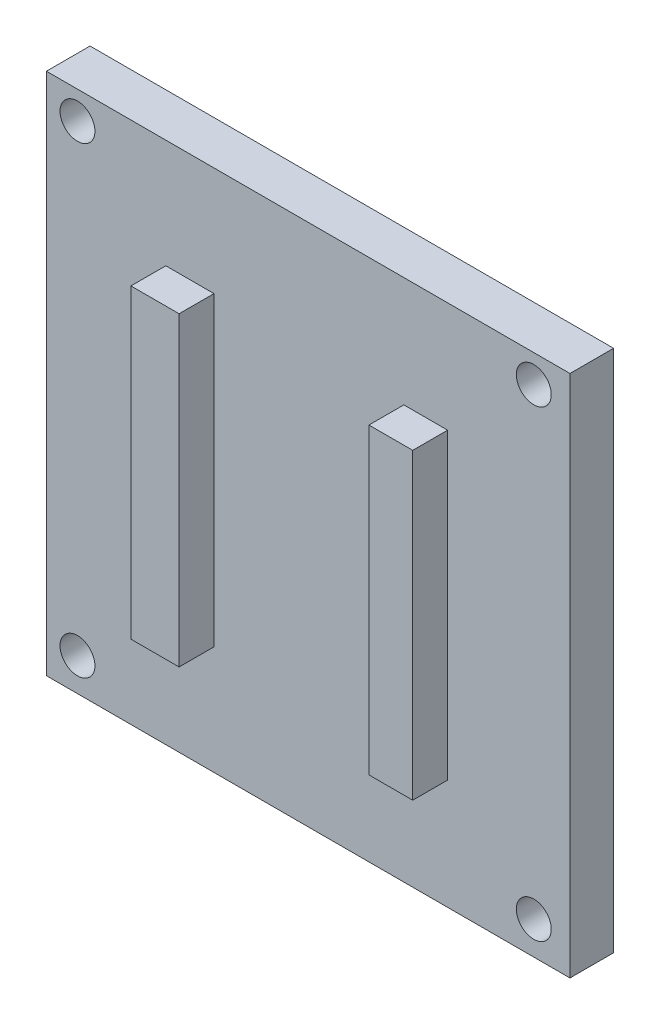
ISO-10303-21;
HEADER;
FILE_DESCRIPTION(('STEP AP214'),'2;1');
FILE_NAME('part.step','',(''),(''),'','','');
FILE_SCHEMA(('AUTOMOTIVE_DESIGN { 1 0 10303 214 1 1 1 1 }'));
ENDSEC;
DATA;
#1=APPLICATION_CONTEXT('core data for automotive mechanical design processes');
#2=APPLICATION_PROTOCOL_DEFINITION('international standard','automotive_design',2000,#1);
#3=PRODUCT_CONTEXT('',#1,'mechanical');
#4=PRODUCT('Part','Part','',(#3));
#5=PRODUCT_RELATED_PRODUCT_CATEGORY('part','',(#4));
#6=PRODUCT_DEFINITION_FORMATION('','',#4);
#7=PRODUCT_DEFINITION_CONTEXT('part definition',#1,'design');
#8=PRODUCT_DEFINITION('design','',#6,#7);
#9=PRODUCT_DEFINITION_SHAPE('','',#8);
#10=(LENGTH_UNIT() NAMED_UNIT(*) SI_UNIT(.MILLI.,.METRE.));
#11=(NAMED_UNIT(*) PLANE_ANGLE_UNIT() SI_UNIT($,.RADIAN.));
#12=(NAMED_UNIT(*) SI_UNIT($,.STERADIAN.) SOLID_ANGLE_UNIT());
#13=UNCERTAINTY_MEASURE_WITH_UNIT(LENGTH_MEASURE(1.E-05),#10,'distance_accuracy_value','');
#14=(GEOMETRIC_REPRESENTATION_CONTEXT(3) GLOBAL_UNCERTAINTY_ASSIGNED_CONTEXT((#13)) GLOBAL_UNIT_ASSIGNED_CONTEXT((#10,
#11,#12)) REPRESENTATION_CONTEXT('',''));
#15=CARTESIAN_POINT('',(0.,0.,0.));
#16=DIRECTION('',(0.,0.,1.));
#17=DIRECTION('',(1.,0.,0.));
#18=AXIS2_PLACEMENT_3D('',#15,#16,#17);
#19=CARTESIAN_POINT('',(0.,0.,0.));
#20=DIRECTION('',(0.,0.,-1.));
#21=DIRECTION('',(-1.,0.,0.));
#22=AXIS2_PLACEMENT_3D('',#19,#20,#21);
#23=PLANE('',#22);
#24=DIRECTION('',(0.,1.,0.));
#25=VECTOR('',#24,1.);
#26=CARTESIAN_POINT('',(-10.7939558553877,17.5297190054551,0.));
#27=LINE('',#26,#25);
#28=CARTESIAN_POINT('',(-10.7939558553877,-17.5297190054551,0.));
#29=VERTEX_POINT('',#28);
#30=CARTESIAN_POINT('',(-10.7939558553877,17.5297190054551,0.));
#31=VERTEX_POINT('',#30);
#32=EDGE_CURVE('E158',#29,#31,#27,.T.);
#33=ORIENTED_EDGE('',*,*,#32,.F.);
#34=DIRECTION('',(1.,0.,0.));
#35=VECTOR('',#34,1.);
#36=CARTESIAN_POINT('',(-16.316444897679,-17.5297190054551,0.));
#37=LINE('',#36,#35);
#38=CARTESIAN_POINT('',(-16.316444897679,-17.5297190054551,0.));
#39=VERTEX_POINT('',#38);
#40=EDGE_CURVE('E174',#39,#29,#37,.T.);
#41=ORIENTED_EDGE('',*,*,#40,.F.);
#42=DIRECTION('',(0.,-1.,0.));
#43=VECTOR('',#42,1.);
#44=CARTESIAN_POINT('',(-16.316444897679,17.5297190054551,0.));
#45=LINE('',#44,#43);
#46=CARTESIAN_POINT('',(-16.316444897679,17.5297190054551,0.));
#47=VERTEX_POINT('',#46);
#48=EDGE_CURVE('E187',#47,#39,#45,.T.);
#49=ORIENTED_EDGE('',*,*,#48,.F.);
#50=DIRECTION('',(-1.,0.,0.));
#51=VECTOR('',#50,1.);
#52=CARTESIAN_POINT('',(-16.316444897679,17.5297190054551,0.));
#53=LINE('',#52,#51);
#54=EDGE_CURVE('E163',#31,#47,#53,.T.);
#55=ORIENTED_EDGE('',*,*,#54,.F.);
#56=EDGE_LOOP('',(#33,#41,#49,#55));
#57=FACE_BOUND('',#56,.T.);
#58=CARTESIAN_POINT('',(25.8552896070914,-26.231822950884,0.));
#59=DIRECTION('',(0.,0.,1.));
#60=DIRECTION('',(1.,0.,0.));
#61=AXIS2_PLACEMENT_3D('',#58,#59,#60);
#62=CIRCLE('',#61,2.);
#63=CARTESIAN_POINT('',(27.8552896070914,-26.231822950884,0.));
#64=VERTEX_POINT('',#63);
#65=EDGE_CURVE('E209',#64,#64,#62,.T.);
#66=ORIENTED_EDGE('',*,*,#65,.F.);
#67=EDGE_LOOP('',(#66));
#68=FACE_BOUND('',#67,.T.);
#69=CARTESIAN_POINT('',(25.8552896070914,26.8175414856725,0.));
#70=DIRECTION('',(0.,0.,1.));
#71=DIRECTION('',(1.,0.,0.));
#72=AXIS2_PLACEMENT_3D('',#69,#70,#71);
#73=CIRCLE('',#72,2.);
#74=CARTESIAN_POINT('',(27.8552896070914,26.8175414856725,0.));
#75=VERTEX_POINT('',#74);
#76=EDGE_CURVE('E214',#75,#75,#73,.T.);
#77=ORIENTED_EDGE('',*,*,#76,.F.);
#78=EDGE_LOOP('',(#77));
#79=FACE_BOUND('',#78,.T.);
#80=CARTESIAN_POINT('',(-26.4410081418799,-26.231822950884,0.));
#81=DIRECTION('',(0.,0.,1.));
#82=DIRECTION('',(1.,0.,0.));
#83=AXIS2_PLACEMENT_3D('',#80,#81,#82);
#84=CIRCLE('',#83,2.);
#85=CARTESIAN_POINT('',(-24.4410081418799,-26.231822950884,0.));
#86=VERTEX_POINT('',#85);
#87=EDGE_CURVE('E222',#86,#86,#84,.T.);
#88=ORIENTED_EDGE('',*,*,#87,.F.);
#89=EDGE_LOOP('',(#88));
#90=FACE_BOUND('',#89,.T.);
#91=CARTESIAN_POINT('',(-26.4410081418799,26.8175414856725,0.));
#92=DIRECTION('',(0.,0.,1.));
#93=DIRECTION('',(1.,0.,0.));
#94=AXIS2_PLACEMENT_3D('',#91,#92,#93);
#95=CIRCLE('',#94,2.);
#96=CARTESIAN_POINT('',(-24.4410081418799,26.8175414856725,0.));
#97=VERTEX_POINT('',#96);
#98=EDGE_CURVE('E230',#97,#97,#95,.T.);
#99=ORIENTED_EDGE('',*,*,#98,.F.);
#100=EDGE_LOOP('',(#99));
#101=FACE_BOUND('',#100,.T.);
#102=DIRECTION('',(0.,1.,0.));
#103=VECTOR('',#102,1.);
#104=CARTESIAN_POINT('',(30.,-30.,0.));
#105=LINE('',#104,#103);
#106=CARTESIAN_POINT('',(30.,-30.,0.));
#107=VERTEX_POINT('',#106);
#108=CARTESIAN_POINT('',(30.,30.,0.));
#109=VERTEX_POINT('',#108);
#110=EDGE_CURVE('E238',#107,#109,#105,.T.);
#111=ORIENTED_EDGE('',*,*,#110,.T.);
#112=DIRECTION('',(-1.,0.,0.));
#113=VECTOR('',#112,1.);
#114=CARTESIAN_POINT('',(-30.,30.,0.));
#115=LINE('',#114,#113);
#116=CARTESIAN_POINT('',(-30.,30.,0.));
#117=VERTEX_POINT('',#116);
#118=EDGE_CURVE('E262',#109,#117,#115,.T.);
#119=ORIENTED_EDGE('',*,*,#118,.T.);
#120=DIRECTION('',(0.,-1.,0.));
#121=VECTOR('',#120,1.);
#122=CARTESIAN_POINT('',(-30.,-30.,0.));
#123=LINE('',#122,#121);
#124=CARTESIAN_POINT('',(-30.,-30.,0.));
#125=VERTEX_POINT('',#124);
#126=EDGE_CURVE('E266',#117,#125,#123,.T.);
#127=ORIENTED_EDGE('',*,*,#126,.T.);
#128=DIRECTION('',(1.,0.,0.));
#129=VECTOR('',#128,1.);
#130=CARTESIAN_POINT('',(-30.,-30.,0.));
#131=LINE('',#130,#129);
#132=EDGE_CURVE('E247',#125,#107,#131,.T.);
#133=ORIENTED_EDGE('',*,*,#132,.T.);
#134=EDGE_LOOP('',(#111,#119,#127,#133));
#135=FACE_BOUND('',#134,.T.);
#136=DIRECTION('',(0.,1.,0.));
#137=VECTOR('',#136,1.);
#138=CARTESIAN_POINT('',(15.9817485920856,17.3623708526584,0.));
#139=LINE('',#138,#137);
#140=CARTESIAN_POINT('',(15.9817485920856,-17.3623708526584,0.));
#141=VERTEX_POINT('',#140);
#142=CARTESIAN_POINT('',(15.9817485920856,17.3623708526584,0.));
#143=VERTEX_POINT('',#142);
#144=EDGE_CURVE('E156',#141,#143,#139,.T.);
#145=ORIENTED_EDGE('',*,*,#144,.F.);
#146=DIRECTION('',(1.,0.,0.));
#147=VECTOR('',#146,1.);
#148=CARTESIAN_POINT('',(10.9613040081844,-17.3623708526584,0.));
#149=LINE('',#148,#147);
#150=CARTESIAN_POINT('',(10.9613040081844,-17.3623708526584,0.));
#151=VERTEX_POINT('',#150);
#152=EDGE_CURVE('E153',#151,#141,#149,.T.);
#153=ORIENTED_EDGE('',*,*,#152,.F.);
#154=DIRECTION('',(0.,-1.,0.));
#155=VECTOR('',#154,1.);
#156=CARTESIAN_POINT('',(10.9613040081844,17.3623708526584,0.));
#157=LINE('',#156,#155);
#158=CARTESIAN_POINT('',(10.9613040081844,17.3623708526584,0.));
#159=VERTEX_POINT('',#158);
#160=EDGE_CURVE('E66',#159,#151,#157,.T.);
#161=ORIENTED_EDGE('',*,*,#160,.F.);
#162=DIRECTION('',(-1.,0.,0.));
#163=VECTOR('',#162,1.);
#164=CARTESIAN_POINT('',(10.9613040081844,17.3623708526584,0.));
#165=LINE('',#164,#163);
#166=EDGE_CURVE('E61',#143,#159,#165,.T.);
#167=ORIENTED_EDGE('',*,*,#166,.F.);
#168=EDGE_LOOP('',(#145,#153,#161,#167));
#169=FACE_BOUND('',#168,.T.);
#170=ADVANCED_FACE('F43',(#57,#68,#79,#90,#101,#135,#169),#23,.F.);
#171=CARTESIAN_POINT('',(30.,-30.,-5.));
#172=DIRECTION('',(1.,0.,0.));
#173=DIRECTION('',(0.,0.,-1.));
#174=AXIS2_PLACEMENT_3D('',#171,#172,#173);
#175=PLANE('',#174);
#176=ORIENTED_EDGE('',*,*,#110,.F.);
#177=DIRECTION('',(0.,0.,1.));
#178=VECTOR('',#177,1.);
#179=CARTESIAN_POINT('',(30.,-30.,-5.));
#180=LINE('',#179,#178);
#181=CARTESIAN_POINT('',(30.,-30.,-5.));
#182=VERTEX_POINT('',#181);
#183=EDGE_CURVE('E11',#182,#107,#180,.T.);
#184=ORIENTED_EDGE('',*,*,#183,.F.);
#185=DIRECTION('',(0.,1.,0.));
#186=VECTOR('',#185,1.);
#187=CARTESIAN_POINT('',(30.,-30.,-5.));
#188=LINE('',#187,#186);
#189=CARTESIAN_POINT('',(30.,30.,-5.));
#190=VERTEX_POINT('',#189);
#191=EDGE_CURVE('E242',#182,#190,#188,.T.);
#192=ORIENTED_EDGE('',*,*,#191,.T.);
#193=DIRECTION('',(0.,0.,1.));
#194=VECTOR('',#193,1.);
#195=CARTESIAN_POINT('',(30.,30.,-5.));
#196=LINE('',#195,#194);
#197=EDGE_CURVE('E47',#190,#109,#196,.T.);
#198=ORIENTED_EDGE('',*,*,#197,.T.);
#199=EDGE_LOOP('',(#176,#184,#192,#198));
#200=FACE_BOUND('',#199,.T.);
#201=ADVANCED_FACE('F45',(#200),#175,.T.);
#202=CARTESIAN_POINT('',(-30.,-30.,-5.));
#203=DIRECTION('',(0.,-1.,0.));
#204=DIRECTION('',(0.,0.,-1.));
#205=AXIS2_PLACEMENT_3D('',#202,#203,#204);
#206=PLANE('',#205);
#207=ORIENTED_EDGE('',*,*,#132,.F.);
#208=DIRECTION('',(0.,0.,1.));
#209=VECTOR('',#208,1.);
#210=CARTESIAN_POINT('',(-30.,-30.,-5.));
#211=LINE('',#210,#209);
#212=CARTESIAN_POINT('',(-30.,-30.,-5.));
#213=VERTEX_POINT('',#212);
#214=EDGE_CURVE('E53',#213,#125,#211,.T.);
#215=ORIENTED_EDGE('',*,*,#214,.F.);
#216=DIRECTION('',(1.,0.,0.));
#217=VECTOR('',#216,1.);
#218=CARTESIAN_POINT('',(-30.,-30.,-5.));
#219=LINE('',#218,#217);
#220=EDGE_CURVE('E255',#213,#182,#219,.T.);
#221=ORIENTED_EDGE('',*,*,#220,.T.);
#222=ORIENTED_EDGE('',*,*,#183,.T.);
#223=EDGE_LOOP('',(#207,#215,#221,#222));
#224=FACE_BOUND('',#223,.T.);
#225=ADVANCED_FACE('F288',(#224),#206,.T.);
#226=CARTESIAN_POINT('',(-30.,-30.,-5.));
#227=DIRECTION('',(-1.,0.,0.));
#228=DIRECTION('',(0.,0.,1.));
#229=AXIS2_PLACEMENT_3D('',#226,#227,#228);
#230=PLANE('',#229);
#231=ORIENTED_EDGE('',*,*,#126,.F.);
#232=DIRECTION('',(0.,0.,1.));
#233=VECTOR('',#232,1.);
#234=CARTESIAN_POINT('',(-30.,30.,-5.));
#235=LINE('',#234,#233);
#236=CARTESIAN_POINT('',(-30.,30.,-5.));
#237=VERTEX_POINT('',#236);
#238=EDGE_CURVE('E274',#237,#117,#235,.T.);
#239=ORIENTED_EDGE('',*,*,#238,.F.);
#240=DIRECTION('',(0.,-1.,0.));
#241=VECTOR('',#240,1.);
#242=CARTESIAN_POINT('',(-30.,-30.,-5.));
#243=LINE('',#242,#241);
#244=EDGE_CURVE('E251',#237,#213,#243,.T.);
#245=ORIENTED_EDGE('',*,*,#244,.T.);
#246=ORIENTED_EDGE('',*,*,#214,.T.);
#247=EDGE_LOOP('',(#231,#239,#245,#246));
#248=FACE_BOUND('',#247,.T.);
#249=ADVANCED_FACE('F294',(#248),#230,.T.);
#250=CARTESIAN_POINT('',(-30.,30.,-5.));
#251=DIRECTION('',(0.,1.,0.));
#252=DIRECTION('',(0.,0.,1.));
#253=AXIS2_PLACEMENT_3D('',#250,#251,#252);
#254=PLANE('',#253);
#255=ORIENTED_EDGE('',*,*,#118,.F.);
#256=ORIENTED_EDGE('',*,*,#197,.F.);
#257=DIRECTION('',(-1.,0.,0.));
#258=VECTOR('',#257,1.);
#259=CARTESIAN_POINT('',(-30.,30.,-5.));
#260=LINE('',#259,#258);
#261=EDGE_CURVE('E246',#190,#237,#260,.T.);
#262=ORIENTED_EDGE('',*,*,#261,.T.);
#263=ORIENTED_EDGE('',*,*,#238,.T.);
#264=EDGE_LOOP('',(#255,#256,#262,#263));
#265=FACE_BOUND('',#264,.T.);
#266=ADVANCED_FACE('F284',(#265),#254,.T.);
#267=CARTESIAN_POINT('',(0.,0.,-5.));
#268=DIRECTION('',(0.,0.,-1.));
#269=DIRECTION('',(-1.,0.,0.));
#270=AXIS2_PLACEMENT_3D('',#267,#268,#269);
#271=PLANE('',#270);
#272=CARTESIAN_POINT('',(25.8552896070914,-26.231822950884,-5.));
#273=DIRECTION('',(0.,0.,1.));
#274=DIRECTION('',(1.,0.,0.));
#275=AXIS2_PLACEMENT_3D('',#272,#273,#274);
#276=CIRCLE('',#275,2.);
#277=CARTESIAN_POINT('',(27.8552896070914,-26.231822950884,-5.));
#278=VERTEX_POINT('',#277);
#279=EDGE_CURVE('E210',#278,#278,#276,.T.);
#280=ORIENTED_EDGE('',*,*,#279,.T.);
#281=EDGE_LOOP('',(#280));
#282=FACE_BOUND('',#281,.T.);
#283=CARTESIAN_POINT('',(25.8552896070914,26.8175414856725,-5.));
#284=DIRECTION('',(0.,0.,1.));
#285=DIRECTION('',(1.,0.,0.));
#286=AXIS2_PLACEMENT_3D('',#283,#284,#285);
#287=CIRCLE('',#286,2.);
#288=CARTESIAN_POINT('',(27.8552896070914,26.8175414856725,-5.));
#289=VERTEX_POINT('',#288);
#290=EDGE_CURVE('E218',#289,#289,#287,.T.);
#291=ORIENTED_EDGE('',*,*,#290,.T.);
#292=EDGE_LOOP('',(#291));
#293=FACE_BOUND('',#292,.T.);
#294=CARTESIAN_POINT('',(-26.4410081418799,-26.231822950884,-5.));
#295=DIRECTION('',(0.,0.,1.));
#296=DIRECTION('',(1.,0.,0.));
#297=AXIS2_PLACEMENT_3D('',#294,#295,#296);
#298=CIRCLE('',#297,2.);
#299=CARTESIAN_POINT('',(-24.4410081418799,-26.231822950884,-5.));
#300=VERTEX_POINT('',#299);
#301=EDGE_CURVE('E226',#300,#300,#298,.T.);
#302=ORIENTED_EDGE('',*,*,#301,.T.);
#303=EDGE_LOOP('',(#302));
#304=FACE_BOUND('',#303,.T.);
#305=CARTESIAN_POINT('',(-26.4410081418799,26.8175414856725,-5.));
#306=DIRECTION('',(0.,0.,1.));
#307=DIRECTION('',(1.,0.,0.));
#308=AXIS2_PLACEMENT_3D('',#305,#306,#307);
#309=CIRCLE('',#308,2.);
#310=CARTESIAN_POINT('',(-24.4410081418799,26.8175414856725,-5.));
#311=VERTEX_POINT('',#310);
#312=EDGE_CURVE('E234',#311,#311,#309,.T.);
#313=ORIENTED_EDGE('',*,*,#312,.T.);
#314=EDGE_LOOP('',(#313));
#315=FACE_BOUND('',#314,.T.);
#316=ORIENTED_EDGE('',*,*,#191,.F.);
#317=ORIENTED_EDGE('',*,*,#220,.F.);
#318=ORIENTED_EDGE('',*,*,#244,.F.);
#319=ORIENTED_EDGE('',*,*,#261,.F.);
#320=EDGE_LOOP('',(#316,#317,#318,#319));
#321=FACE_BOUND('',#320,.T.);
#322=ADVANCED_FACE('F291',(#282,#293,#304,#315,#321),#271,.T.);
#323=CARTESIAN_POINT('',(-26.4410081418799,26.8175414856725,-5.));
#324=DIRECTION('',(0.,0.,1.));
#325=DIRECTION('',(1.,0.,0.));
#326=AXIS2_PLACEMENT_3D('',#323,#324,#325);
#327=CYLINDRICAL_SURFACE('',#326,2.);
#328=ORIENTED_EDGE('',*,*,#312,.F.);
#329=EDGE_LOOP('',(#328));
#330=FACE_BOUND('',#329,.T.);
#331=ORIENTED_EDGE('',*,*,#98,.T.);
#332=EDGE_LOOP('',(#331));
#333=FACE_BOUND('',#332,.T.);
#334=ADVANCED_FACE('F312',(#330,#333),#327,.F.);
#335=CARTESIAN_POINT('',(-26.4410081418799,-26.231822950884,-5.));
#336=DIRECTION('',(0.,0.,1.));
#337=DIRECTION('',(1.,0.,0.));
#338=AXIS2_PLACEMENT_3D('',#335,#336,#337);
#339=CYLINDRICAL_SURFACE('',#338,2.);
#340=ORIENTED_EDGE('',*,*,#301,.F.);
#341=EDGE_LOOP('',(#340));
#342=FACE_BOUND('',#341,.T.);
#343=ORIENTED_EDGE('',*,*,#87,.T.);
#344=EDGE_LOOP('',(#343));
#345=FACE_BOUND('',#344,.T.);
#346=ADVANCED_FACE('F316',(#342,#345),#339,.F.);
#347=CARTESIAN_POINT('',(25.8552896070914,26.8175414856725,-5.));
#348=DIRECTION('',(0.,0.,1.));
#349=DIRECTION('',(1.,0.,0.));
#350=AXIS2_PLACEMENT_3D('',#347,#348,#349);
#351=CYLINDRICAL_SURFACE('',#350,2.);
#352=ORIENTED_EDGE('',*,*,#290,.F.);
#353=EDGE_LOOP('',(#352));
#354=FACE_BOUND('',#353,.T.);
#355=ORIENTED_EDGE('',*,*,#76,.T.);
#356=EDGE_LOOP('',(#355));
#357=FACE_BOUND('',#356,.T.);
#358=ADVANCED_FACE('F320',(#354,#357),#351,.F.);
#359=CARTESIAN_POINT('',(25.8552896070914,-26.231822950884,-5.));
#360=DIRECTION('',(0.,0.,1.));
#361=DIRECTION('',(1.,0.,0.));
#362=AXIS2_PLACEMENT_3D('',#359,#360,#361);
#363=CYLINDRICAL_SURFACE('',#362,2.);
#364=ORIENTED_EDGE('',*,*,#279,.F.);
#365=EDGE_LOOP('',(#364));
#366=FACE_BOUND('',#365,.T.);
#367=ORIENTED_EDGE('',*,*,#65,.T.);
#368=EDGE_LOOP('',(#367));
#369=FACE_BOUND('',#368,.T.);
#370=ADVANCED_FACE('F324',(#366,#369),#363,.F.);
#371=CARTESIAN_POINT('',(-10.7939558553877,17.5297190054551,4.));
#372=DIRECTION('',(-1.,0.,0.));
#373=DIRECTION('',(0.,-1.,0.));
#374=AXIS2_PLACEMENT_3D('',#371,#372,#373);
#375=PLANE('',#374);
#376=ORIENTED_EDGE('',*,*,#32,.T.);
#377=DIRECTION('',(0.,0.,-1.));
#378=VECTOR('',#377,1.);
#379=CARTESIAN_POINT('',(-10.7939558553877,17.5297190054551,4.));
#380=LINE('',#379,#378);
#381=CARTESIAN_POINT('',(-10.7939558553877,17.5297190054551,4.));
#382=VERTEX_POINT('',#381);
#383=EDGE_CURVE('E205',#382,#31,#380,.T.);
#384=ORIENTED_EDGE('',*,*,#383,.F.);
#385=DIRECTION('',(0.,1.,0.));
#386=VECTOR('',#385,1.);
#387=CARTESIAN_POINT('',(-10.7939558553877,17.5297190054551,4.));
#388=LINE('',#387,#386);
#389=CARTESIAN_POINT('',(-10.7939558553877,-17.5297190054551,4.));
#390=VERTEX_POINT('',#389);
#391=EDGE_CURVE('E169',#390,#382,#388,.T.);
#392=ORIENTED_EDGE('',*,*,#391,.F.);
#393=DIRECTION('',(0.,0.,-1.));
#394=VECTOR('',#393,1.);
#395=CARTESIAN_POINT('',(-10.7939558553877,-17.5297190054551,4.));
#396=LINE('',#395,#394);
#397=EDGE_CURVE('E182',#390,#29,#396,.T.);
#398=ORIENTED_EDGE('',*,*,#397,.T.);
#399=EDGE_LOOP('',(#376,#384,#392,#398));
#400=FACE_BOUND('',#399,.T.);
#401=ADVANCED_FACE('F328',(#400),#375,.F.);
#402=CARTESIAN_POINT('',(-16.316444897679,17.5297190054551,4.));
#403=DIRECTION('',(0.,-1.,0.));
#404=DIRECTION('',(0.,0.,-1.));
#405=AXIS2_PLACEMENT_3D('',#402,#403,#404);
#406=PLANE('',#405);
#407=ORIENTED_EDGE('',*,*,#54,.T.);
#408=DIRECTION('',(0.,0.,-1.));
#409=VECTOR('',#408,1.);
#410=CARTESIAN_POINT('',(-16.316444897679,17.5297190054551,4.));
#411=LINE('',#410,#409);
#412=CARTESIAN_POINT('',(-16.316444897679,17.5297190054551,4.));
#413=VERTEX_POINT('',#412);
#414=EDGE_CURVE('E201',#413,#47,#411,.T.);
#415=ORIENTED_EDGE('',*,*,#414,.F.);
#416=DIRECTION('',(-1.,0.,0.));
#417=VECTOR('',#416,1.);
#418=CARTESIAN_POINT('',(-16.316444897679,17.5297190054551,4.));
#419=LINE('',#418,#417);
#420=EDGE_CURVE('E173',#382,#413,#419,.T.);
#421=ORIENTED_EDGE('',*,*,#420,.F.);
#422=ORIENTED_EDGE('',*,*,#383,.T.);
#423=EDGE_LOOP('',(#407,#415,#421,#422));
#424=FACE_BOUND('',#423,.T.);
#425=ADVANCED_FACE('F332',(#424),#406,.F.);
#426=CARTESIAN_POINT('',(-16.316444897679,17.5297190054551,4.));
#427=DIRECTION('',(1.,0.,0.));
#428=DIRECTION('',(0.,0.,-1.));
#429=AXIS2_PLACEMENT_3D('',#426,#427,#428);
#430=PLANE('',#429);
#431=ORIENTED_EDGE('',*,*,#48,.T.);
#432=DIRECTION('',(0.,0.,-1.));
#433=VECTOR('',#432,1.);
#434=CARTESIAN_POINT('',(-16.316444897679,-17.5297190054551,4.));
#435=LINE('',#434,#433);
#436=CARTESIAN_POINT('',(-16.316444897679,-17.5297190054551,4.));
#437=VERTEX_POINT('',#436);
#438=EDGE_CURVE('E197',#437,#39,#435,.T.);
#439=ORIENTED_EDGE('',*,*,#438,.F.);
#440=DIRECTION('',(0.,-1.,0.));
#441=VECTOR('',#440,1.);
#442=CARTESIAN_POINT('',(-16.316444897679,17.5297190054551,4.));
#443=LINE('',#442,#441);
#444=EDGE_CURVE('E177',#413,#437,#443,.T.);
#445=ORIENTED_EDGE('',*,*,#444,.F.);
#446=ORIENTED_EDGE('',*,*,#414,.T.);
#447=EDGE_LOOP('',(#431,#439,#445,#446));
#448=FACE_BOUND('',#447,.T.);
#449=ADVANCED_FACE('F336',(#448),#430,.F.);
#450=CARTESIAN_POINT('',(-16.316444897679,-17.5297190054551,4.));
#451=DIRECTION('',(0.,1.,0.));
#452=DIRECTION('',(0.,0.,1.));
#453=AXIS2_PLACEMENT_3D('',#450,#451,#452);
#454=PLANE('',#453);
#455=ORIENTED_EDGE('',*,*,#40,.T.);
#456=ORIENTED_EDGE('',*,*,#397,.F.);
#457=DIRECTION('',(1.,0.,0.));
#458=VECTOR('',#457,1.);
#459=CARTESIAN_POINT('',(-16.316444897679,-17.5297190054551,4.));
#460=LINE('',#459,#458);
#461=EDGE_CURVE('E180',#437,#390,#460,.T.);
#462=ORIENTED_EDGE('',*,*,#461,.F.);
#463=ORIENTED_EDGE('',*,*,#438,.T.);
#464=EDGE_LOOP('',(#455,#456,#462,#463));
#465=FACE_BOUND('',#464,.T.);
#466=ADVANCED_FACE('F340',(#465),#454,.F.);
#467=CARTESIAN_POINT('',(0.,0.,4.));
#468=DIRECTION('',(0.,0.,1.));
#469=DIRECTION('',(1.,0.,0.));
#470=AXIS2_PLACEMENT_3D('',#467,#468,#469);
#471=PLANE('',#470);
#472=ORIENTED_EDGE('',*,*,#391,.T.);
#473=ORIENTED_EDGE('',*,*,#420,.T.);
#474=ORIENTED_EDGE('',*,*,#444,.T.);
#475=ORIENTED_EDGE('',*,*,#461,.T.);
#476=EDGE_LOOP('',(#472,#473,#474,#475));
#477=FACE_BOUND('',#476,.T.);
#478=ADVANCED_FACE('F344',(#477),#471,.T.);
#479=CARTESIAN_POINT('',(15.9817485920856,17.3623708526584,4.));
#480=DIRECTION('',(-1.,0.,0.));
#481=DIRECTION('',(0.,0.,1.));
#482=AXIS2_PLACEMENT_3D('',#479,#480,#481);
#483=PLANE('',#482);
#484=ORIENTED_EDGE('',*,*,#144,.T.);
#485=DIRECTION('',(0.,0.,-1.));
#486=VECTOR('',#485,1.);
#487=CARTESIAN_POINT('',(15.9817485920856,17.3623708526584,4.));
#488=LINE('',#487,#486);
#489=CARTESIAN_POINT('',(15.9817485920856,17.3623708526584,4.));
#490=VERTEX_POINT('',#489);
#491=EDGE_CURVE('E135',#490,#143,#488,.T.);
#492=ORIENTED_EDGE('',*,*,#491,.F.);
#493=DIRECTION('',(0.,1.,0.));
#494=VECTOR('',#493,1.);
#495=CARTESIAN_POINT('',(15.9817485920856,17.3623708526584,4.));
#496=LINE('',#495,#494);
#497=CARTESIAN_POINT('',(15.9817485920856,-17.3623708526584,4.));
#498=VERTEX_POINT('',#497);
#499=EDGE_CURVE('E143',#498,#490,#496,.T.);
#500=ORIENTED_EDGE('',*,*,#499,.F.);
#501=DIRECTION('',(0.,0.,-1.));
#502=VECTOR('',#501,1.);
#503=CARTESIAN_POINT('',(15.9817485920856,-17.3623708526584,4.));
#504=LINE('',#503,#502);
#505=EDGE_CURVE('E520',#498,#141,#504,.T.);
#506=ORIENTED_EDGE('',*,*,#505,.T.);
#507=EDGE_LOOP('',(#484,#492,#500,#506));
#508=FACE_BOUND('',#507,.T.);
#509=ADVANCED_FACE('F155',(#508),#483,.F.);
#510=CARTESIAN_POINT('',(10.9613040081844,17.3623708526584,4.));
#511=DIRECTION('',(0.,-1.,0.));
#512=DIRECTION('',(0.,0.,-1.));
#513=AXIS2_PLACEMENT_3D('',#510,#511,#512);
#514=PLANE('',#513);
#515=ORIENTED_EDGE('',*,*,#166,.T.);
#516=DIRECTION('',(0.,0.,-1.));
#517=VECTOR('',#516,1.);
#518=CARTESIAN_POINT('',(10.9613040081844,17.3623708526584,4.));
#519=LINE('',#518,#517);
#520=CARTESIAN_POINT('',(10.9613040081844,17.3623708526584,4.));
#521=VERTEX_POINT('',#520);
#522=EDGE_CURVE('E138',#521,#159,#519,.T.);
#523=ORIENTED_EDGE('',*,*,#522,.F.);
#524=DIRECTION('',(-1.,0.,0.));
#525=VECTOR('',#524,1.);
#526=CARTESIAN_POINT('',(10.9613040081844,17.3623708526584,4.));
#527=LINE('',#526,#525);
#528=EDGE_CURVE('E131',#490,#521,#527,.T.);
#529=ORIENTED_EDGE('',*,*,#528,.F.);
#530=ORIENTED_EDGE('',*,*,#491,.T.);
#531=EDGE_LOOP('',(#515,#523,#529,#530));
#532=FACE_BOUND('',#531,.T.);
#533=ADVANCED_FACE('F133',(#532),#514,.F.);
#534=CARTESIAN_POINT('',(10.9613040081844,17.3623708526584,4.));
#535=DIRECTION('',(1.,0.,0.));
#536=DIRECTION('',(0.,1.,0.));
#537=AXIS2_PLACEMENT_3D('',#534,#535,#536);
#538=PLANE('',#537);
#539=ORIENTED_EDGE('',*,*,#160,.T.);
#540=DIRECTION('',(0.,0.,-1.));
#541=VECTOR('',#540,1.);
#542=CARTESIAN_POINT('',(10.9613040081844,-17.3623708526584,4.));
#543=LINE('',#542,#541);
#544=CARTESIAN_POINT('',(10.9613040081844,-17.3623708526584,4.));
#545=VERTEX_POINT('',#544);
#546=EDGE_CURVE('E165',#545,#151,#543,.T.);
#547=ORIENTED_EDGE('',*,*,#546,.F.);
#548=DIRECTION('',(0.,-1.,0.));
#549=VECTOR('',#548,1.);
#550=CARTESIAN_POINT('',(10.9613040081844,17.3623708526584,4.));
#551=LINE('',#550,#549);
#552=EDGE_CURVE('E142',#521,#545,#551,.T.);
#553=ORIENTED_EDGE('',*,*,#552,.F.);
#554=ORIENTED_EDGE('',*,*,#522,.T.);
#555=EDGE_LOOP('',(#539,#547,#553,#554));
#556=FACE_BOUND('',#555,.T.);
#557=ADVANCED_FACE('F353',(#556),#538,.F.);
#558=CARTESIAN_POINT('',(10.9613040081844,-17.3623708526584,4.));
#559=DIRECTION('',(0.,1.,0.));
#560=DIRECTION('',(0.,0.,1.));
#561=AXIS2_PLACEMENT_3D('',#558,#559,#560);
#562=PLANE('',#561);
#563=ORIENTED_EDGE('',*,*,#152,.T.);
#564=ORIENTED_EDGE('',*,*,#505,.F.);
#565=DIRECTION('',(1.,0.,0.));
#566=VECTOR('',#565,1.);
#567=CARTESIAN_POINT('',(10.9613040081844,-17.3623708526584,4.));
#568=LINE('',#567,#566);
#569=EDGE_CURVE('E148',#545,#498,#568,.T.);
#570=ORIENTED_EDGE('',*,*,#569,.F.);
#571=ORIENTED_EDGE('',*,*,#546,.T.);
#572=EDGE_LOOP('',(#563,#564,#570,#571));
#573=FACE_BOUND('',#572,.T.);
#574=ADVANCED_FACE('F356',(#573),#562,.F.);
#575=CARTESIAN_POINT('',(0.,0.,4.));
#576=DIRECTION('',(0.,0.,1.));
#577=DIRECTION('',(1.,0.,0.));
#578=AXIS2_PLACEMENT_3D('',#575,#576,#577);
#579=PLANE('',#578);
#580=ORIENTED_EDGE('',*,*,#499,.T.);
#581=ORIENTED_EDGE('',*,*,#528,.T.);
#582=ORIENTED_EDGE('',*,*,#552,.T.);
#583=ORIENTED_EDGE('',*,*,#569,.T.);
#584=EDGE_LOOP('',(#580,#581,#582,#583));
#585=FACE_BOUND('',#584,.T.);
#586=ADVANCED_FACE('F146',(#585),#579,.T.);
#587=CLOSED_SHELL('',(#170,#201,#225,#249,#266,#322,#334,#346,#358,#370,#401,#425,#449,#466,
#478,#509,#533,#557,#574,#586));
#588=MANIFOLD_SOLID_BREP('B2',#587);
#589=ADVANCED_BREP_SHAPE_REPRESENTATION('',(#18,#588),#14);
#590=SHAPE_DEFINITION_REPRESENTATION(#9,#589);
ENDSEC;
END-ISO-10303-21;
